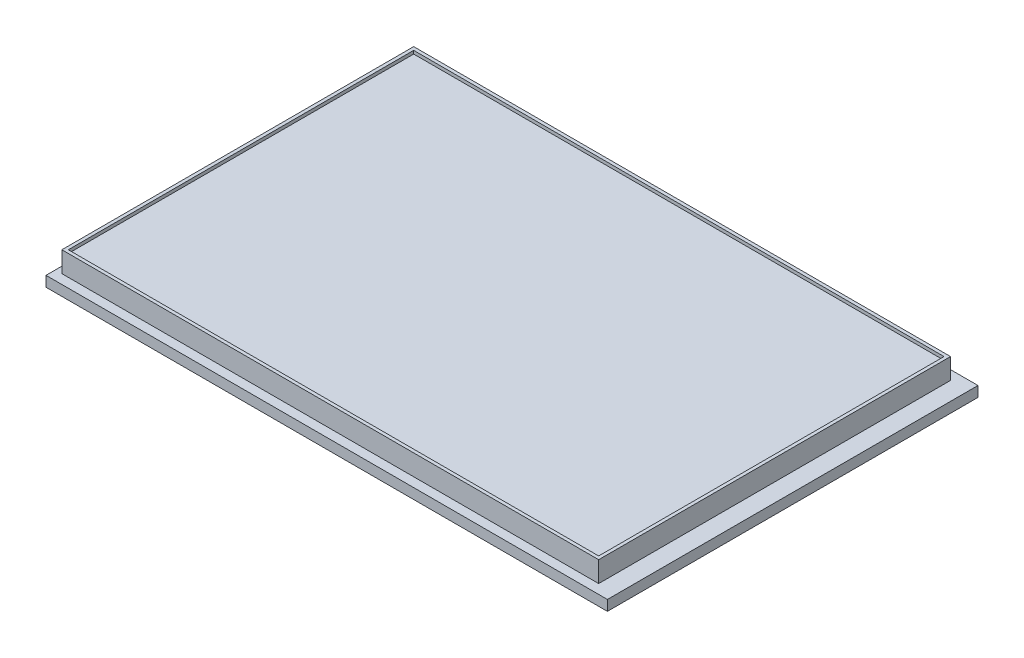
ISO-10303-21;
HEADER;
FILE_DESCRIPTION(('STEP AP214'),'2;1');
FILE_NAME('part.step','',(''),(''),'','','');
FILE_SCHEMA(('AUTOMOTIVE_DESIGN { 1 0 10303 214 1 1 1 1 }'));
ENDSEC;
DATA;
#1=APPLICATION_CONTEXT('core data for automotive mechanical design processes');
#2=APPLICATION_PROTOCOL_DEFINITION('international standard','automotive_design',2000,#1);
#3=PRODUCT_CONTEXT('',#1,'mechanical');
#4=PRODUCT('Part','Part','',(#3));
#5=PRODUCT_RELATED_PRODUCT_CATEGORY('part','',(#4));
#6=PRODUCT_DEFINITION_FORMATION('','',#4);
#7=PRODUCT_DEFINITION_CONTEXT('part definition',#1,'design');
#8=PRODUCT_DEFINITION('design','',#6,#7);
#9=PRODUCT_DEFINITION_SHAPE('','',#8);
#10=(LENGTH_UNIT() NAMED_UNIT(*) SI_UNIT(.MILLI.,.METRE.));
#11=(NAMED_UNIT(*) PLANE_ANGLE_UNIT() SI_UNIT($,.RADIAN.));
#12=(NAMED_UNIT(*) SI_UNIT($,.STERADIAN.) SOLID_ANGLE_UNIT());
#13=UNCERTAINTY_MEASURE_WITH_UNIT(LENGTH_MEASURE(1.E-05),#10,'distance_accuracy_value','');
#14=(GEOMETRIC_REPRESENTATION_CONTEXT(3) GLOBAL_UNCERTAINTY_ASSIGNED_CONTEXT((#13)) GLOBAL_UNIT_ASSIGNED_CONTEXT((#10,
#11,#12)) REPRESENTATION_CONTEXT('',''));
#15=CARTESIAN_POINT('',(0.,0.,0.));
#16=DIRECTION('',(0.,0.,1.));
#17=DIRECTION('',(1.,0.,0.));
#18=AXIS2_PLACEMENT_3D('',#15,#16,#17);
#19=CARTESIAN_POINT('',(43.4,1.6,-28.65));
#20=DIRECTION('',(-1.,0.,0.));
#21=DIRECTION('',(0.,0.,1.));
#22=AXIS2_PLACEMENT_3D('',#19,#20,#21);
#23=PLANE('',#22);
#24=DIRECTION('',(0.,0.,-1.));
#25=VECTOR('',#24,1.);
#26=CARTESIAN_POINT('',(43.4,0.,-28.65));
#27=LINE('',#26,#25);
#28=CARTESIAN_POINT('',(43.4,0.,28.65));
#29=VERTEX_POINT('',#28);
#30=CARTESIAN_POINT('',(43.4,0.,-28.65));
#31=VERTEX_POINT('',#30);
#32=EDGE_CURVE('E198',#29,#31,#27,.T.);
#33=ORIENTED_EDGE('',*,*,#32,.T.);
#34=DIRECTION('',(0.,-1.,0.));
#35=VECTOR('',#34,1.);
#36=CARTESIAN_POINT('',(43.4,1.6,-28.65));
#37=LINE('',#36,#35);
#38=CARTESIAN_POINT('',(43.4,1.6,-28.65));
#39=VERTEX_POINT('',#38);
#40=EDGE_CURVE('E11',#39,#31,#37,.T.);
#41=ORIENTED_EDGE('',*,*,#40,.F.);
#42=DIRECTION('',(0.,0.,-1.));
#43=VECTOR('',#42,1.);
#44=CARTESIAN_POINT('',(43.4,1.6,-28.65));
#45=LINE('',#44,#43);
#46=CARTESIAN_POINT('',(43.4,1.6,28.65));
#47=VERTEX_POINT('',#46);
#48=EDGE_CURVE('E199',#47,#39,#45,.T.);
#49=ORIENTED_EDGE('',*,*,#48,.F.);
#50=DIRECTION('',(0.,-1.,0.));
#51=VECTOR('',#50,1.);
#52=CARTESIAN_POINT('',(43.4,1.6,28.65));
#53=LINE('',#52,#51);
#54=EDGE_CURVE('E209',#47,#29,#53,.T.);
#55=ORIENTED_EDGE('',*,*,#54,.T.);
#56=EDGE_LOOP('',(#33,#41,#49,#55));
#57=FACE_BOUND('',#56,.T.);
#58=ADVANCED_FACE('F42',(#57),#23,.F.);
#59=CARTESIAN_POINT('',(-43.4,1.6,-28.65));
#60=DIRECTION('',(0.,0.,1.));
#61=DIRECTION('',(1.,0.,0.));
#62=AXIS2_PLACEMENT_3D('',#59,#60,#61);
#63=PLANE('',#62);
#64=DIRECTION('',(-1.,0.,0.));
#65=VECTOR('',#64,1.);
#66=CARTESIAN_POINT('',(-43.4,0.,-28.65));
#67=LINE('',#66,#65);
#68=CARTESIAN_POINT('',(-43.4,0.,-28.65));
#69=VERTEX_POINT('',#68);
#70=EDGE_CURVE('E212',#31,#69,#67,.T.);
#71=ORIENTED_EDGE('',*,*,#70,.T.);
#72=DIRECTION('',(0.,-1.,0.));
#73=VECTOR('',#72,1.);
#74=CARTESIAN_POINT('',(-43.4,1.6,-28.65));
#75=LINE('',#74,#73);
#76=CARTESIAN_POINT('',(-43.4,1.6,-28.65));
#77=VERTEX_POINT('',#76);
#78=EDGE_CURVE('E49',#77,#69,#75,.T.);
#79=ORIENTED_EDGE('',*,*,#78,.F.);
#80=DIRECTION('',(-1.,0.,0.));
#81=VECTOR('',#80,1.);
#82=CARTESIAN_POINT('',(-43.4,1.6,-28.65));
#83=LINE('',#82,#81);
#84=EDGE_CURVE('E202',#39,#77,#83,.T.);
#85=ORIENTED_EDGE('',*,*,#84,.F.);
#86=ORIENTED_EDGE('',*,*,#40,.T.);
#87=EDGE_LOOP('',(#71,#79,#85,#86));
#88=FACE_BOUND('',#87,.T.);
#89=ADVANCED_FACE('F242',(#88),#63,.F.);
#90=CARTESIAN_POINT('',(-43.4,1.6,-28.65));
#91=DIRECTION('',(1.,0.,0.));
#92=DIRECTION('',(0.,0.,-1.));
#93=AXIS2_PLACEMENT_3D('',#90,#91,#92);
#94=PLANE('',#93);
#95=DIRECTION('',(0.,0.,1.));
#96=VECTOR('',#95,1.);
#97=CARTESIAN_POINT('',(-43.4,0.,-28.65));
#98=LINE('',#97,#96);
#99=CARTESIAN_POINT('',(-43.4,0.,28.65));
#100=VERTEX_POINT('',#99);
#101=EDGE_CURVE('E214',#69,#100,#98,.T.);
#102=ORIENTED_EDGE('',*,*,#101,.T.);
#103=DIRECTION('',(0.,-1.,0.));
#104=VECTOR('',#103,1.);
#105=CARTESIAN_POINT('',(-43.4,1.6,28.65));
#106=LINE('',#105,#104);
#107=CARTESIAN_POINT('',(-43.4,1.6,28.65));
#108=VERTEX_POINT('',#107);
#109=EDGE_CURVE('E219',#108,#100,#106,.T.);
#110=ORIENTED_EDGE('',*,*,#109,.F.);
#111=DIRECTION('',(0.,0.,1.));
#112=VECTOR('',#111,1.);
#113=CARTESIAN_POINT('',(-43.4,1.6,-28.65));
#114=LINE('',#113,#112);
#115=EDGE_CURVE('E205',#77,#108,#114,.T.);
#116=ORIENTED_EDGE('',*,*,#115,.F.);
#117=ORIENTED_EDGE('',*,*,#78,.T.);
#118=EDGE_LOOP('',(#102,#110,#116,#117));
#119=FACE_BOUND('',#118,.T.);
#120=ADVANCED_FACE('F226',(#119),#94,.F.);
#121=CARTESIAN_POINT('',(-43.4,1.6,28.65));
#122=DIRECTION('',(0.,0.,-1.));
#123=DIRECTION('',(-1.,0.,0.));
#124=AXIS2_PLACEMENT_3D('',#121,#122,#123);
#125=PLANE('',#124);
#126=DIRECTION('',(1.,0.,0.));
#127=VECTOR('',#126,1.);
#128=CARTESIAN_POINT('',(-43.4,0.,28.65));
#129=LINE('',#128,#127);
#130=EDGE_CURVE('E203',#100,#29,#129,.T.);
#131=ORIENTED_EDGE('',*,*,#130,.T.);
#132=ORIENTED_EDGE('',*,*,#54,.F.);
#133=DIRECTION('',(1.,0.,0.));
#134=VECTOR('',#133,1.);
#135=CARTESIAN_POINT('',(-43.4,1.6,28.65));
#136=LINE('',#135,#134);
#137=EDGE_CURVE('E207',#108,#47,#136,.T.);
#138=ORIENTED_EDGE('',*,*,#137,.F.);
#139=ORIENTED_EDGE('',*,*,#109,.T.);
#140=EDGE_LOOP('',(#131,#132,#138,#139));
#141=FACE_BOUND('',#140,.T.);
#142=ADVANCED_FACE('F235',(#141),#125,.F.);
#143=CARTESIAN_POINT('',(0.,1.6,0.));
#144=DIRECTION('',(0.,1.,0.));
#145=DIRECTION('',(0.,0.,1.));
#146=AXIS2_PLACEMENT_3D('',#143,#144,#145);
#147=PLANE('',#146);
#148=DIRECTION('',(0.,0.,-1.));
#149=VECTOR('',#148,1.);
#150=CARTESIAN_POINT('',(40.6,1.6,-27.2));
#151=LINE('',#150,#149);
#152=CARTESIAN_POINT('',(40.6,1.6,27.2));
#153=VERTEX_POINT('',#152);
#154=CARTESIAN_POINT('',(40.6,1.6,-27.2));
#155=VERTEX_POINT('',#154);
#156=EDGE_CURVE('E64',#153,#155,#151,.T.);
#157=ORIENTED_EDGE('',*,*,#156,.F.);
#158=DIRECTION('',(1.,0.,0.));
#159=VECTOR('',#158,1.);
#160=CARTESIAN_POINT('',(-42.4,1.6,27.2));
#161=LINE('',#160,#159);
#162=CARTESIAN_POINT('',(-42.4,1.6,27.2));
#163=VERTEX_POINT('',#162);
#164=EDGE_CURVE('E172',#163,#153,#161,.T.);
#165=ORIENTED_EDGE('',*,*,#164,.F.);
#166=DIRECTION('',(0.,0.,1.));
#167=VECTOR('',#166,1.);
#168=CARTESIAN_POINT('',(-42.4,1.6,-27.2));
#169=LINE('',#168,#167);
#170=CARTESIAN_POINT('',(-42.4,1.6,-27.2));
#171=VERTEX_POINT('',#170);
#172=EDGE_CURVE('E183',#171,#163,#169,.T.);
#173=ORIENTED_EDGE('',*,*,#172,.F.);
#174=DIRECTION('',(-1.,0.,0.));
#175=VECTOR('',#174,1.);
#176=CARTESIAN_POINT('',(-42.4,1.6,-27.2));
#177=LINE('',#176,#175);
#178=EDGE_CURVE('E180',#155,#171,#177,.T.);
#179=ORIENTED_EDGE('',*,*,#178,.F.);
#180=EDGE_LOOP('',(#157,#165,#173,#179));
#181=FACE_BOUND('',#180,.T.);
#182=ORIENTED_EDGE('',*,*,#48,.T.);
#183=ORIENTED_EDGE('',*,*,#84,.T.);
#184=ORIENTED_EDGE('',*,*,#115,.T.);
#185=ORIENTED_EDGE('',*,*,#137,.T.);
#186=EDGE_LOOP('',(#182,#183,#184,#185));
#187=FACE_BOUND('',#186,.T.);
#188=ADVANCED_FACE('F241',(#181,#187),#147,.T.);
#189=CARTESIAN_POINT('',(0.,0.,0.));
#190=DIRECTION('',(0.,1.,0.));
#191=DIRECTION('',(0.,0.,1.));
#192=AXIS2_PLACEMENT_3D('',#189,#190,#191);
#193=PLANE('',#192);
#194=ORIENTED_EDGE('',*,*,#32,.F.);
#195=ORIENTED_EDGE('',*,*,#130,.F.);
#196=ORIENTED_EDGE('',*,*,#101,.F.);
#197=ORIENTED_EDGE('',*,*,#70,.F.);
#198=EDGE_LOOP('',(#194,#195,#196,#197));
#199=FACE_BOUND('',#198,.T.);
#200=ADVANCED_FACE('F232',(#199),#193,.F.);
#201=CARTESIAN_POINT('',(40.6,4.8,-27.2));
#202=DIRECTION('',(-1.,0.,0.));
#203=DIRECTION('',(0.,0.,1.));
#204=AXIS2_PLACEMENT_3D('',#201,#202,#203);
#205=PLANE('',#204);
#206=ORIENTED_EDGE('',*,*,#156,.T.);
#207=DIRECTION('',(0.,-1.,0.));
#208=VECTOR('',#207,1.);
#209=CARTESIAN_POINT('',(40.6,4.8,-27.2));
#210=LINE('',#209,#208);
#211=CARTESIAN_POINT('',(40.6,4.8,-27.2));
#212=VERTEX_POINT('',#211);
#213=EDGE_CURVE('E195',#212,#155,#210,.T.);
#214=ORIENTED_EDGE('',*,*,#213,.F.);
#215=DIRECTION('',(0.,0.,-1.));
#216=VECTOR('',#215,1.);
#217=CARTESIAN_POINT('',(40.6,4.8,-27.2));
#218=LINE('',#217,#216);
#219=CARTESIAN_POINT('',(40.6,4.8,27.2));
#220=VERTEX_POINT('',#219);
#221=EDGE_CURVE('E168',#220,#212,#218,.T.);
#222=ORIENTED_EDGE('',*,*,#221,.F.);
#223=DIRECTION('',(0.,-1.,0.));
#224=VECTOR('',#223,1.);
#225=CARTESIAN_POINT('',(40.6,4.8,27.2));
#226=LINE('',#225,#224);
#227=EDGE_CURVE('E178',#220,#153,#226,.T.);
#228=ORIENTED_EDGE('',*,*,#227,.T.);
#229=EDGE_LOOP('',(#206,#214,#222,#228));
#230=FACE_BOUND('',#229,.T.);
#231=ADVANCED_FACE('F254',(#230),#205,.F.);
#232=CARTESIAN_POINT('',(-42.4,4.8,-27.2));
#233=DIRECTION('',(0.,0.,1.));
#234=DIRECTION('',(1.,0.,0.));
#235=AXIS2_PLACEMENT_3D('',#232,#233,#234);
#236=PLANE('',#235);
#237=ORIENTED_EDGE('',*,*,#178,.T.);
#238=DIRECTION('',(0.,-1.,0.));
#239=VECTOR('',#238,1.);
#240=CARTESIAN_POINT('',(-42.4,4.8,-27.2));
#241=LINE('',#240,#239);
#242=CARTESIAN_POINT('',(-42.4,4.8,-27.2));
#243=VERTEX_POINT('',#242);
#244=EDGE_CURVE('E192',#243,#171,#241,.T.);
#245=ORIENTED_EDGE('',*,*,#244,.F.);
#246=DIRECTION('',(-1.,0.,0.));
#247=VECTOR('',#246,1.);
#248=CARTESIAN_POINT('',(-42.4,4.8,-27.2));
#249=LINE('',#248,#247);
#250=EDGE_CURVE('E171',#212,#243,#249,.T.);
#251=ORIENTED_EDGE('',*,*,#250,.F.);
#252=ORIENTED_EDGE('',*,*,#213,.T.);
#253=EDGE_LOOP('',(#237,#245,#251,#252));
#254=FACE_BOUND('',#253,.T.);
#255=ADVANCED_FACE('F259',(#254),#236,.F.);
#256=CARTESIAN_POINT('',(-42.4,4.8,-27.2));
#257=DIRECTION('',(1.,0.,0.));
#258=DIRECTION('',(0.,0.,-1.));
#259=AXIS2_PLACEMENT_3D('',#256,#257,#258);
#260=PLANE('',#259);
#261=ORIENTED_EDGE('',*,*,#172,.T.);
#262=DIRECTION('',(0.,-1.,0.));
#263=VECTOR('',#262,1.);
#264=CARTESIAN_POINT('',(-42.4,4.8,27.2));
#265=LINE('',#264,#263);
#266=CARTESIAN_POINT('',(-42.4,4.8,27.2));
#267=VERTEX_POINT('',#266);
#268=EDGE_CURVE('E189',#267,#163,#265,.T.);
#269=ORIENTED_EDGE('',*,*,#268,.F.);
#270=DIRECTION('',(0.,0.,1.));
#271=VECTOR('',#270,1.);
#272=CARTESIAN_POINT('',(-42.4,4.8,-27.2));
#273=LINE('',#272,#271);
#274=EDGE_CURVE('E174',#243,#267,#273,.T.);
#275=ORIENTED_EDGE('',*,*,#274,.F.);
#276=ORIENTED_EDGE('',*,*,#244,.T.);
#277=EDGE_LOOP('',(#261,#269,#275,#276));
#278=FACE_BOUND('',#277,.T.);
#279=ADVANCED_FACE('F263',(#278),#260,.F.);
#280=CARTESIAN_POINT('',(-42.4,4.8,27.2));
#281=DIRECTION('',(0.,0.,-1.));
#282=DIRECTION('',(-1.,0.,0.));
#283=AXIS2_PLACEMENT_3D('',#280,#281,#282);
#284=PLANE('',#283);
#285=ORIENTED_EDGE('',*,*,#164,.T.);
#286=ORIENTED_EDGE('',*,*,#227,.F.);
#287=DIRECTION('',(1.,0.,0.));
#288=VECTOR('',#287,1.);
#289=CARTESIAN_POINT('',(-42.4,4.8,27.2));
#290=LINE('',#289,#288);
#291=EDGE_CURVE('E176',#267,#220,#290,.T.);
#292=ORIENTED_EDGE('',*,*,#291,.F.);
#293=ORIENTED_EDGE('',*,*,#268,.T.);
#294=EDGE_LOOP('',(#285,#286,#292,#293));
#295=FACE_BOUND('',#294,.T.);
#296=ADVANCED_FACE('F267',(#295),#284,.F.);
#297=CARTESIAN_POINT('',(0.,4.8,0.));
#298=DIRECTION('',(0.,1.,0.));
#299=DIRECTION('',(0.,0.,1.));
#300=AXIS2_PLACEMENT_3D('',#297,#298,#299);
#301=PLANE('',#300);
#302=DIRECTION('',(0.,0.,-1.));
#303=VECTOR('',#302,1.);
#304=CARTESIAN_POINT('',(40.1,4.8,-26.7));
#305=LINE('',#304,#303);
#306=CARTESIAN_POINT('',(40.1,4.8,26.7));
#307=VERTEX_POINT('',#306);
#308=CARTESIAN_POINT('',(40.1,4.8,-26.7));
#309=VERTEX_POINT('',#308);
#310=EDGE_CURVE('E56',#307,#309,#305,.T.);
#311=ORIENTED_EDGE('',*,*,#310,.F.);
#312=DIRECTION('',(1.,0.,0.));
#313=VECTOR('',#312,1.);
#314=CARTESIAN_POINT('',(-41.9,4.8,26.7));
#315=LINE('',#314,#313);
#316=CARTESIAN_POINT('',(-41.9,4.8,26.7));
#317=VERTEX_POINT('',#316);
#318=EDGE_CURVE('E150',#317,#307,#315,.T.);
#319=ORIENTED_EDGE('',*,*,#318,.F.);
#320=DIRECTION('',(0.,0.,1.));
#321=VECTOR('',#320,1.);
#322=CARTESIAN_POINT('',(-41.9,4.8,-26.7));
#323=LINE('',#322,#321);
#324=CARTESIAN_POINT('',(-41.9,4.8,-26.7));
#325=VERTEX_POINT('',#324);
#326=EDGE_CURVE('E153',#325,#317,#323,.T.);
#327=ORIENTED_EDGE('',*,*,#326,.F.);
#328=DIRECTION('',(-1.,0.,0.));
#329=VECTOR('',#328,1.);
#330=CARTESIAN_POINT('',(-41.9,4.8,-26.7));
#331=LINE('',#330,#329);
#332=EDGE_CURVE('E159',#309,#325,#331,.T.);
#333=ORIENTED_EDGE('',*,*,#332,.F.);
#334=EDGE_LOOP('',(#311,#319,#327,#333));
#335=FACE_BOUND('',#334,.T.);
#336=ORIENTED_EDGE('',*,*,#221,.T.);
#337=ORIENTED_EDGE('',*,*,#250,.T.);
#338=ORIENTED_EDGE('',*,*,#274,.T.);
#339=ORIENTED_EDGE('',*,*,#291,.T.);
#340=EDGE_LOOP('',(#336,#337,#338,#339));
#341=FACE_BOUND('',#340,.T.);
#342=ADVANCED_FACE('F271',(#335,#341),#301,.T.);
#343=CARTESIAN_POINT('',(40.1,4.3,-26.7));
#344=DIRECTION('',(1.,0.,0.));
#345=DIRECTION('',(0.,0.,-1.));
#346=AXIS2_PLACEMENT_3D('',#343,#344,#345);
#347=PLANE('',#346);
#348=ORIENTED_EDGE('',*,*,#310,.T.);
#349=DIRECTION('',(0.,1.,0.));
#350=VECTOR('',#349,1.);
#351=CARTESIAN_POINT('',(40.1,4.3,-26.7));
#352=LINE('',#351,#350);
#353=CARTESIAN_POINT('',(40.1,4.3,-26.7));
#354=VERTEX_POINT('',#353);
#355=EDGE_CURVE('E128',#354,#309,#352,.T.);
#356=ORIENTED_EDGE('',*,*,#355,.F.);
#357=DIRECTION('',(0.,0.,-1.));
#358=VECTOR('',#357,1.);
#359=CARTESIAN_POINT('',(40.1,4.3,-26.7));
#360=LINE('',#359,#358);
#361=CARTESIAN_POINT('',(40.1,4.3,26.7));
#362=VERTEX_POINT('',#361);
#363=EDGE_CURVE('E132',#362,#354,#360,.T.);
#364=ORIENTED_EDGE('',*,*,#363,.F.);
#365=DIRECTION('',(0.,1.,0.));
#366=VECTOR('',#365,1.);
#367=CARTESIAN_POINT('',(40.1,4.3,26.7));
#368=LINE('',#367,#366);
#369=EDGE_CURVE('E163',#362,#307,#368,.T.);
#370=ORIENTED_EDGE('',*,*,#369,.T.);
#371=EDGE_LOOP('',(#348,#356,#364,#370));
#372=FACE_BOUND('',#371,.T.);
#373=ADVANCED_FACE('F130',(#372),#347,.F.);
#374=CARTESIAN_POINT('',(-41.9,4.3,26.7));
#375=DIRECTION('',(0.,0.,1.));
#376=DIRECTION('',(1.,0.,0.));
#377=AXIS2_PLACEMENT_3D('',#374,#375,#376);
#378=PLANE('',#377);
#379=ORIENTED_EDGE('',*,*,#318,.T.);
#380=ORIENTED_EDGE('',*,*,#369,.F.);
#381=DIRECTION('',(1.,0.,0.));
#382=VECTOR('',#381,1.);
#383=CARTESIAN_POINT('',(-41.9,4.3,26.7));
#384=LINE('',#383,#382);
#385=CARTESIAN_POINT('',(-41.9,4.3,26.7));
#386=VERTEX_POINT('',#385);
#387=EDGE_CURVE('E138',#386,#362,#384,.T.);
#388=ORIENTED_EDGE('',*,*,#387,.F.);
#389=DIRECTION('',(0.,1.,0.));
#390=VECTOR('',#389,1.);
#391=CARTESIAN_POINT('',(-41.9,4.3,26.7));
#392=LINE('',#391,#390);
#393=EDGE_CURVE('E165',#386,#317,#392,.T.);
#394=ORIENTED_EDGE('',*,*,#393,.T.);
#395=EDGE_LOOP('',(#379,#380,#388,#394));
#396=FACE_BOUND('',#395,.T.);
#397=ADVANCED_FACE('F278',(#396),#378,.F.);
#398=CARTESIAN_POINT('',(-41.9,4.3,-26.7));
#399=DIRECTION('',(-1.,0.,0.));
#400=DIRECTION('',(0.,0.,1.));
#401=AXIS2_PLACEMENT_3D('',#398,#399,#400);
#402=PLANE('',#401);
#403=ORIENTED_EDGE('',*,*,#326,.T.);
#404=ORIENTED_EDGE('',*,*,#393,.F.);
#405=DIRECTION('',(0.,0.,1.));
#406=VECTOR('',#405,1.);
#407=CARTESIAN_POINT('',(-41.9,4.3,-26.7));
#408=LINE('',#407,#406);
#409=CARTESIAN_POINT('',(-41.9,4.3,-26.7));
#410=VERTEX_POINT('',#409);
#411=EDGE_CURVE('E146',#410,#386,#408,.T.);
#412=ORIENTED_EDGE('',*,*,#411,.F.);
#413=DIRECTION('',(0.,1.,0.));
#414=VECTOR('',#413,1.);
#415=CARTESIAN_POINT('',(-41.9,4.3,-26.7));
#416=LINE('',#415,#414);
#417=EDGE_CURVE('E137',#410,#325,#416,.T.);
#418=ORIENTED_EDGE('',*,*,#417,.T.);
#419=EDGE_LOOP('',(#403,#404,#412,#418));
#420=FACE_BOUND('',#419,.T.);
#421=ADVANCED_FACE('F281',(#420),#402,.F.);
#422=CARTESIAN_POINT('',(-41.9,4.3,-26.7));
#423=DIRECTION('',(0.,0.,-1.));
#424=DIRECTION('',(-1.,0.,0.));
#425=AXIS2_PLACEMENT_3D('',#422,#423,#424);
#426=PLANE('',#425);
#427=ORIENTED_EDGE('',*,*,#332,.T.);
#428=ORIENTED_EDGE('',*,*,#417,.F.);
#429=DIRECTION('',(-1.,0.,0.));
#430=VECTOR('',#429,1.);
#431=CARTESIAN_POINT('',(-41.9,4.3,-26.7));
#432=LINE('',#431,#430);
#433=EDGE_CURVE('E141',#354,#410,#432,.T.);
#434=ORIENTED_EDGE('',*,*,#433,.F.);
#435=ORIENTED_EDGE('',*,*,#355,.T.);
#436=EDGE_LOOP('',(#427,#428,#434,#435));
#437=FACE_BOUND('',#436,.T.);
#438=ADVANCED_FACE('F142',(#437),#426,.F.);
#439=CARTESIAN_POINT('',(0.,4.3,0.));
#440=DIRECTION('',(0.,1.,0.));
#441=DIRECTION('',(0.,0.,1.));
#442=AXIS2_PLACEMENT_3D('',#439,#440,#441);
#443=PLANE('',#442);
#444=ORIENTED_EDGE('',*,*,#363,.T.);
#445=ORIENTED_EDGE('',*,*,#433,.T.);
#446=ORIENTED_EDGE('',*,*,#411,.T.);
#447=ORIENTED_EDGE('',*,*,#387,.T.);
#448=EDGE_LOOP('',(#444,#445,#446,#447));
#449=FACE_BOUND('',#448,.T.);
#450=ADVANCED_FACE('F148',(#449),#443,.T.);
#451=CLOSED_SHELL('',(#58,#89,#120,#142,#188,#200,#231,#255,#279,#296,#342,#373,#397,#421,#438,#450));
#452=MANIFOLD_SOLID_BREP('B2',#451);
#453=ADVANCED_BREP_SHAPE_REPRESENTATION('',(#18,#452),#14);
#454=SHAPE_DEFINITION_REPRESENTATION(#9,#453);
ENDSEC;
END-ISO-10303-21;
